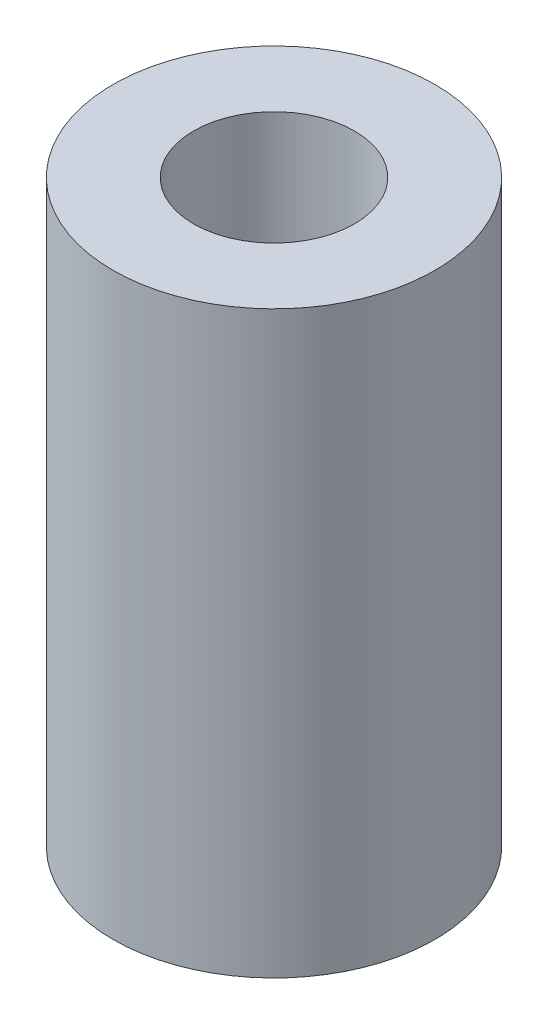
ISO-10303-21;
HEADER;
FILE_DESCRIPTION(('STEP AP214'),'2;1');
FILE_NAME('part.step','',(''),(''),'','','');
FILE_SCHEMA(('AUTOMOTIVE_DESIGN { 1 0 10303 214 1 1 1 1 }'));
ENDSEC;
DATA;
#1=APPLICATION_CONTEXT('core data for automotive mechanical design processes');
#2=APPLICATION_PROTOCOL_DEFINITION('international standard','automotive_design',2000,#1);
#3=PRODUCT_CONTEXT('',#1,'mechanical');
#4=PRODUCT('Part','Part','',(#3));
#5=PRODUCT_RELATED_PRODUCT_CATEGORY('part','',(#4));
#6=PRODUCT_DEFINITION_FORMATION('','',#4);
#7=PRODUCT_DEFINITION_CONTEXT('part definition',#1,'design');
#8=PRODUCT_DEFINITION('design','',#6,#7);
#9=PRODUCT_DEFINITION_SHAPE('','',#8);
#10=(LENGTH_UNIT() NAMED_UNIT(*) SI_UNIT(.MILLI.,.METRE.));
#11=(NAMED_UNIT(*) PLANE_ANGLE_UNIT() SI_UNIT($,.RADIAN.));
#12=(NAMED_UNIT(*) SI_UNIT($,.STERADIAN.) SOLID_ANGLE_UNIT());
#13=UNCERTAINTY_MEASURE_WITH_UNIT(LENGTH_MEASURE(1.E-05),#10,'distance_accuracy_value','');
#14=(GEOMETRIC_REPRESENTATION_CONTEXT(3) GLOBAL_UNCERTAINTY_ASSIGNED_CONTEXT((#13)) GLOBAL_UNIT_ASSIGNED_CONTEXT((#10,
#11,#12)) REPRESENTATION_CONTEXT('',''));
#15=CARTESIAN_POINT('',(0.,0.,0.));
#16=DIRECTION('',(0.,0.,1.));
#17=DIRECTION('',(1.,0.,0.));
#18=AXIS2_PLACEMENT_3D('',#15,#16,#17);
#19=CARTESIAN_POINT('',(0.,25.2,0.));
#20=DIRECTION('',(0.,1.,0.));
#21=DIRECTION('',(0.,0.,1.));
#22=AXIS2_PLACEMENT_3D('',#19,#20,#21);
#23=PLANE('',#22);
#24=CARTESIAN_POINT('',(0.,25.2,0.));
#25=DIRECTION('',(0.,1.,0.));
#26=DIRECTION('',(0.,0.,1.));
#27=AXIS2_PLACEMENT_3D('',#24,#25,#26);
#28=CIRCLE('',#27,7.);
#29=CARTESIAN_POINT('',(0.,25.2,7.));
#30=VERTEX_POINT('',#29);
#31=EDGE_CURVE('E10',#30,#30,#28,.T.);
#32=ORIENTED_EDGE('',*,*,#31,.T.);
#33=EDGE_LOOP('',(#32));
#34=FACE_BOUND('',#33,.T.);
#35=CARTESIAN_POINT('',(0.,25.2,0.));
#36=DIRECTION('',(0.,1.,0.));
#37=DIRECTION('',(0.,0.,1.));
#38=AXIS2_PLACEMENT_3D('',#35,#36,#37);
#39=CIRCLE('',#38,3.5);
#40=CARTESIAN_POINT('',(0.,25.2,3.5));
#41=VERTEX_POINT('',#40);
#42=EDGE_CURVE('E40',#41,#41,#39,.T.);
#43=ORIENTED_EDGE('',*,*,#42,.F.);
#44=EDGE_LOOP('',(#43));
#45=FACE_BOUND('',#44,.T.);
#46=ADVANCED_FACE('F29',(#34,#45),#23,.T.);
#47=CARTESIAN_POINT('',(0.,0.,0.));
#48=DIRECTION('',(0.,1.,0.));
#49=DIRECTION('',(0.,0.,1.));
#50=AXIS2_PLACEMENT_3D('',#47,#48,#49);
#51=PLANE('',#50);
#52=CARTESIAN_POINT('',(0.,0.,0.));
#53=DIRECTION('',(0.,1.,0.));
#54=DIRECTION('',(0.,0.,1.));
#55=AXIS2_PLACEMENT_3D('',#52,#53,#54);
#56=CIRCLE('',#55,7.);
#57=CARTESIAN_POINT('',(0.,0.,7.));
#58=VERTEX_POINT('',#57);
#59=EDGE_CURVE('E33',#58,#58,#56,.T.);
#60=ORIENTED_EDGE('',*,*,#59,.F.);
#61=EDGE_LOOP('',(#60));
#62=FACE_BOUND('',#61,.T.);
#63=CARTESIAN_POINT('',(0.,0.,0.));
#64=DIRECTION('',(0.,1.,0.));
#65=DIRECTION('',(0.,0.,1.));
#66=AXIS2_PLACEMENT_3D('',#63,#64,#65);
#67=CIRCLE('',#66,3.5);
#68=CARTESIAN_POINT('',(0.,0.,3.5));
#69=VERTEX_POINT('',#68);
#70=EDGE_CURVE('E42',#69,#69,#67,.T.);
#71=ORIENTED_EDGE('',*,*,#70,.T.);
#72=EDGE_LOOP('',(#71));
#73=FACE_BOUND('',#72,.T.);
#74=ADVANCED_FACE('F52',(#62,#73),#51,.F.);
#75=CARTESIAN_POINT('',(0.,25.2,0.));
#76=DIRECTION('',(0.,-1.,0.));
#77=DIRECTION('',(0.,0.,-1.));
#78=AXIS2_PLACEMENT_3D('',#75,#76,#77);
#79=CYLINDRICAL_SURFACE('',#78,7.);
#80=ORIENTED_EDGE('',*,*,#31,.F.);
#81=EDGE_LOOP('',(#80));
#82=FACE_BOUND('',#81,.T.);
#83=ORIENTED_EDGE('',*,*,#59,.T.);
#84=EDGE_LOOP('',(#83));
#85=FACE_BOUND('',#84,.T.);
#86=ADVANCED_FACE('F31',(#82,#85),#79,.T.);
#87=CARTESIAN_POINT('',(0.,25.2,0.));
#88=DIRECTION('',(0.,-1.,0.));
#89=DIRECTION('',(0.,0.,-1.));
#90=AXIS2_PLACEMENT_3D('',#87,#88,#89);
#91=CYLINDRICAL_SURFACE('',#90,3.5);
#92=ORIENTED_EDGE('',*,*,#42,.T.);
#93=EDGE_LOOP('',(#92));
#94=FACE_BOUND('',#93,.T.);
#95=ORIENTED_EDGE('',*,*,#70,.F.);
#96=EDGE_LOOP('',(#95));
#97=FACE_BOUND('',#96,.T.);
#98=ADVANCED_FACE('F48',(#94,#97),#91,.F.);
#99=CLOSED_SHELL('',(#46,#74,#86,#98));
#100=MANIFOLD_SOLID_BREP('B2',#99);
#101=ADVANCED_BREP_SHAPE_REPRESENTATION('',(#18,#100),#14);
#102=SHAPE_DEFINITION_REPRESENTATION(#9,#101);
ENDSEC;
END-ISO-10303-21;
